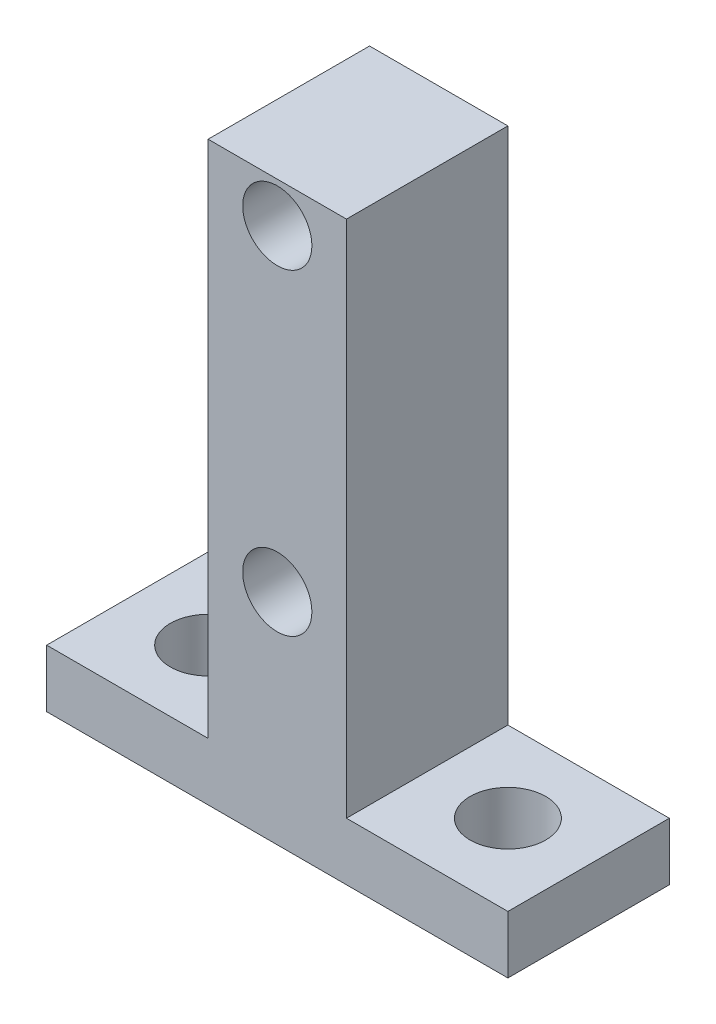
ISO-10303-21;
HEADER;
FILE_DESCRIPTION(('STEP AP214'),'2;1');
FILE_NAME('part.step','',(''),(''),'','','');
FILE_SCHEMA(('AUTOMOTIVE_DESIGN { 1 0 10303 214 1 1 1 1 }'));
ENDSEC;
DATA;
#1=APPLICATION_CONTEXT('core data for automotive mechanical design processes');
#2=APPLICATION_PROTOCOL_DEFINITION('international standard','automotive_design',2000,#1);
#3=PRODUCT_CONTEXT('',#1,'mechanical');
#4=PRODUCT('Part','Part','',(#3));
#5=PRODUCT_RELATED_PRODUCT_CATEGORY('part','',(#4));
#6=PRODUCT_DEFINITION_FORMATION('','',#4);
#7=PRODUCT_DEFINITION_CONTEXT('part definition',#1,'design');
#8=PRODUCT_DEFINITION('design','',#6,#7);
#9=PRODUCT_DEFINITION_SHAPE('','',#8);
#10=(LENGTH_UNIT() NAMED_UNIT(*) SI_UNIT(.MILLI.,.METRE.));
#11=(NAMED_UNIT(*) PLANE_ANGLE_UNIT() SI_UNIT($,.RADIAN.));
#12=(NAMED_UNIT(*) SI_UNIT($,.STERADIAN.) SOLID_ANGLE_UNIT());
#13=UNCERTAINTY_MEASURE_WITH_UNIT(LENGTH_MEASURE(1.E-05),#10,'distance_accuracy_value','');
#14=(GEOMETRIC_REPRESENTATION_CONTEXT(3) GLOBAL_UNCERTAINTY_ASSIGNED_CONTEXT((#13)) GLOBAL_UNIT_ASSIGNED_CONTEXT((#10,
#11,#12)) REPRESENTATION_CONTEXT('',''));
#15=CARTESIAN_POINT('',(0.,0.,0.));
#16=DIRECTION('',(0.,0.,1.));
#17=DIRECTION('',(1.,0.,0.));
#18=AXIS2_PLACEMENT_3D('',#15,#16,#17);
#19=CARTESIAN_POINT('',(0.,-6.35,0.));
#20=DIRECTION('',(0.,-1.,0.));
#21=DIRECTION('',(0.,0.,-1.));
#22=AXIS2_PLACEMENT_3D('',#19,#20,#21);
#23=PLANE('',#22);
#24=CARTESIAN_POINT('',(9.28687500000001,-6.35,20.32));
#25=DIRECTION('',(0.,-1.,0.));
#26=DIRECTION('',(0.,0.,-1.));
#27=AXIS2_PLACEMENT_3D('',#24,#25,#26);
#28=CIRCLE('',#27,2.0828);
#29=CARTESIAN_POINT('',(9.28687500000001,-6.35,18.2372));
#30=VERTEX_POINT('',#29);
#31=EDGE_CURVE('E157',#30,#30,#28,.T.);
#32=ORIENTED_EDGE('',*,*,#31,.F.);
#33=EDGE_LOOP('',(#32));
#34=FACE_BOUND('',#33,.T.);
#35=CARTESIAN_POINT('',(25.796875,-6.35,20.32));
#36=DIRECTION('',(0.,-1.,0.));
#37=DIRECTION('',(0.,0.,-1.));
#38=AXIS2_PLACEMENT_3D('',#35,#36,#37);
#39=CIRCLE('',#38,2.0828);
#40=CARTESIAN_POINT('',(25.796875,-6.35,18.2372));
#41=VERTEX_POINT('',#40);
#42=EDGE_CURVE('E217',#41,#41,#39,.T.);
#43=ORIENTED_EDGE('',*,*,#42,.F.);
#44=EDGE_LOOP('',(#43));
#45=FACE_BOUND('',#44,.T.);
#46=DIRECTION('',(1.,0.,0.));
#47=VECTOR('',#46,1.);
#48=CARTESIAN_POINT('',(21.351875,-6.35,24.765));
#49=LINE('',#48,#47);
#50=CARTESIAN_POINT('',(4.841875,-6.35,24.765));
#51=VERTEX_POINT('',#50);
#52=CARTESIAN_POINT('',(30.241875,-6.35,24.765));
#53=VERTEX_POINT('',#52);
#54=EDGE_CURVE('E199',#51,#53,#49,.T.);
#55=ORIENTED_EDGE('',*,*,#54,.F.);
#56=DIRECTION('',(0.,0.,-1.));
#57=VECTOR('',#56,1.);
#58=CARTESIAN_POINT('',(4.841875,-6.35,0.));
#59=LINE('',#58,#57);
#60=CARTESIAN_POINT('',(4.841875,-6.35,15.875));
#61=VERTEX_POINT('',#60);
#62=EDGE_CURVE('E168',#51,#61,#59,.T.);
#63=ORIENTED_EDGE('',*,*,#62,.T.);
#64=DIRECTION('',(-1.,0.,0.));
#65=VECTOR('',#64,1.);
#66=CARTESIAN_POINT('',(21.351875,-6.35,15.875));
#67=LINE('',#66,#65);
#68=CARTESIAN_POINT('',(30.241875,-6.35,15.875));
#69=VERTEX_POINT('',#68);
#70=EDGE_CURVE('E202',#69,#61,#67,.T.);
#71=ORIENTED_EDGE('',*,*,#70,.F.);
#72=DIRECTION('',(0.,0.,-1.));
#73=VECTOR('',#72,1.);
#74=CARTESIAN_POINT('',(30.241875,-6.35,0.));
#75=LINE('',#74,#73);
#76=EDGE_CURVE('E152',#53,#69,#75,.T.);
#77=ORIENTED_EDGE('',*,*,#76,.F.);
#78=EDGE_LOOP('',(#55,#63,#71,#77));
#79=FACE_BOUND('',#78,.T.);
#80=ADVANCED_FACE('F38',(#34,#45,#79),#23,.T.);
#81=CARTESIAN_POINT('',(21.351875,-6.35,24.765));
#82=DIRECTION('',(0.,0.,1.));
#83=DIRECTION('',(1.,0.,0.));
#84=AXIS2_PLACEMENT_3D('',#81,#82,#83);
#85=PLANE('',#84);
#86=DIRECTION('',(1.,0.,0.));
#87=VECTOR('',#86,1.);
#88=CARTESIAN_POINT('',(21.351875,-3.175,24.765));
#89=LINE('',#88,#87);
#90=CARTESIAN_POINT('',(21.351875,-3.175,24.765));
#91=VERTEX_POINT('',#90);
#92=CARTESIAN_POINT('',(30.241875,-3.175,24.765));
#93=VERTEX_POINT('',#92);
#94=EDGE_CURVE('E132',#91,#93,#89,.T.);
#95=ORIENTED_EDGE('',*,*,#94,.F.);
#96=DIRECTION('',(0.,1.,0.));
#97=VECTOR('',#96,1.);
#98=CARTESIAN_POINT('',(21.351875,-6.35,24.765));
#99=LINE('',#98,#97);
#100=CARTESIAN_POINT('',(21.351875,25.4,24.765));
#101=VERTEX_POINT('',#100);
#102=EDGE_CURVE('E119',#91,#101,#99,.T.);
#103=ORIENTED_EDGE('',*,*,#102,.T.);
#104=DIRECTION('',(1.,0.,0.));
#105=VECTOR('',#104,1.);
#106=CARTESIAN_POINT('',(21.351875,25.4,24.765));
#107=LINE('',#106,#105);
#108=CARTESIAN_POINT('',(13.731875,25.4,24.765));
#109=VERTEX_POINT('',#108);
#110=EDGE_CURVE('E187',#109,#101,#107,.T.);
#111=ORIENTED_EDGE('',*,*,#110,.F.);
#112=DIRECTION('',(0.,1.,0.));
#113=VECTOR('',#112,1.);
#114=CARTESIAN_POINT('',(13.731875,-6.35,24.765));
#115=LINE('',#114,#113);
#116=CARTESIAN_POINT('',(13.731875,-3.17500000000001,24.765));
#117=VERTEX_POINT('',#116);
#118=EDGE_CURVE('E48',#117,#109,#115,.T.);
#119=ORIENTED_EDGE('',*,*,#118,.F.);
#120=DIRECTION('',(1.,0.,0.));
#121=VECTOR('',#120,1.);
#122=CARTESIAN_POINT('',(4.841875,-3.175,24.765));
#123=LINE('',#122,#121);
#124=CARTESIAN_POINT('',(4.841875,-3.175,24.765));
#125=VERTEX_POINT('',#124);
#126=EDGE_CURVE('E140',#125,#117,#123,.T.);
#127=ORIENTED_EDGE('',*,*,#126,.F.);
#128=DIRECTION('',(0.,1.,0.));
#129=VECTOR('',#128,1.);
#130=CARTESIAN_POINT('',(4.841875,-18.9223585694968,24.765));
#131=LINE('',#130,#129);
#132=EDGE_CURVE('E150',#51,#125,#131,.T.);
#133=ORIENTED_EDGE('',*,*,#132,.F.);
#134=ORIENTED_EDGE('',*,*,#54,.T.);
#135=DIRECTION('',(0.,1.,0.));
#136=VECTOR('',#135,1.);
#137=CARTESIAN_POINT('',(30.241875,-18.9223585694968,24.765));
#138=LINE('',#137,#136);
#139=EDGE_CURVE('E151',#53,#93,#138,.T.);
#140=ORIENTED_EDGE('',*,*,#139,.T.);
#141=EDGE_LOOP('',(#95,#103,#111,#119,#127,#133,#134,#140));
#142=FACE_BOUND('',#141,.T.);
#143=CARTESIAN_POINT('',(17.541875,5.715,24.765));
#144=DIRECTION('',(0.,0.,1.));
#145=DIRECTION('',(1.,0.,0.));
#146=AXIS2_PLACEMENT_3D('',#143,#144,#145);
#147=CIRCLE('',#146,1.905);
#148=CARTESIAN_POINT('',(19.446875,5.715,24.765));
#149=VERTEX_POINT('',#148);
#150=EDGE_CURVE('E183',#149,#149,#147,.T.);
#151=ORIENTED_EDGE('',*,*,#150,.F.);
#152=EDGE_LOOP('',(#151));
#153=FACE_BOUND('',#152,.T.);
#154=CARTESIAN_POINT('',(17.541875,23.1775,24.765));
#155=DIRECTION('',(0.,0.,1.));
#156=DIRECTION('',(1.,0.,0.));
#157=AXIS2_PLACEMENT_3D('',#154,#155,#156);
#158=CIRCLE('',#157,1.905);
#159=CARTESIAN_POINT('',(19.446875,23.1775,24.765));
#160=VERTEX_POINT('',#159);
#161=EDGE_CURVE('E178',#160,#160,#158,.T.);
#162=ORIENTED_EDGE('',*,*,#161,.F.);
#163=EDGE_LOOP('',(#162));
#164=FACE_BOUND('',#163,.T.);
#165=ADVANCED_FACE('F40',(#142,#153,#164),#85,.T.);
#166=CARTESIAN_POINT('',(21.351875,-6.35,15.875));
#167=DIRECTION('',(0.,0.,-1.));
#168=DIRECTION('',(-1.,0.,0.));
#169=AXIS2_PLACEMENT_3D('',#166,#167,#168);
#170=PLANE('',#169);
#171=CARTESIAN_POINT('',(17.541875,5.715,15.875));
#172=DIRECTION('',(0.,0.,-1.));
#173=DIRECTION('',(-1.,0.,0.));
#174=AXIS2_PLACEMENT_3D('',#171,#172,#173);
#175=CIRCLE('',#174,1.905);
#176=CARTESIAN_POINT('',(19.446875,5.715,15.875));
#177=VERTEX_POINT('',#176);
#178=EDGE_CURVE('E182',#177,#177,#175,.T.);
#179=ORIENTED_EDGE('',*,*,#178,.F.);
#180=EDGE_LOOP('',(#179));
#181=FACE_BOUND('',#180,.T.);
#182=CARTESIAN_POINT('',(17.541875,23.1775,15.875));
#183=DIRECTION('',(0.,0.,-1.));
#184=DIRECTION('',(-1.,0.,0.));
#185=AXIS2_PLACEMENT_3D('',#182,#183,#184);
#186=CIRCLE('',#185,1.905);
#187=CARTESIAN_POINT('',(19.446875,23.1775,15.875));
#188=VERTEX_POINT('',#187);
#189=EDGE_CURVE('E172',#188,#188,#186,.T.);
#190=ORIENTED_EDGE('',*,*,#189,.F.);
#191=EDGE_LOOP('',(#190));
#192=FACE_BOUND('',#191,.T.);
#193=DIRECTION('',(0.,1.,0.));
#194=VECTOR('',#193,1.);
#195=CARTESIAN_POINT('',(21.351875,-6.35,15.875));
#196=LINE('',#195,#194);
#197=CARTESIAN_POINT('',(21.351875,-3.175,15.875));
#198=VERTEX_POINT('',#197);
#199=CARTESIAN_POINT('',(21.351875,25.4,15.875));
#200=VERTEX_POINT('',#199);
#201=EDGE_CURVE('E107',#198,#200,#196,.T.);
#202=ORIENTED_EDGE('',*,*,#201,.F.);
#203=DIRECTION('',(-1.,0.,0.));
#204=VECTOR('',#203,1.);
#205=CARTESIAN_POINT('',(-27.543125,-3.175,15.875));
#206=LINE('',#205,#204);
#207=CARTESIAN_POINT('',(30.241875,-3.175,15.875));
#208=VERTEX_POINT('',#207);
#209=EDGE_CURVE('E11',#208,#198,#206,.T.);
#210=ORIENTED_EDGE('',*,*,#209,.F.);
#211=DIRECTION('',(0.,1.,0.));
#212=VECTOR('',#211,1.);
#213=CARTESIAN_POINT('',(30.241875,-18.9223585694968,15.875));
#214=LINE('',#213,#212);
#215=EDGE_CURVE('E156',#69,#208,#214,.T.);
#216=ORIENTED_EDGE('',*,*,#215,.F.);
#217=ORIENTED_EDGE('',*,*,#70,.T.);
#218=DIRECTION('',(0.,1.,0.));
#219=VECTOR('',#218,1.);
#220=CARTESIAN_POINT('',(4.841875,-18.9223585694968,15.875));
#221=LINE('',#220,#219);
#222=CARTESIAN_POINT('',(4.84187500000001,-3.175,15.875));
#223=VERTEX_POINT('',#222);
#224=EDGE_CURVE('E167',#61,#223,#221,.T.);
#225=ORIENTED_EDGE('',*,*,#224,.T.);
#226=DIRECTION('',(-1.,0.,0.));
#227=VECTOR('',#226,1.);
#228=CARTESIAN_POINT('',(21.351875,-3.17500000000001,15.875));
#229=LINE('',#228,#227);
#230=CARTESIAN_POINT('',(13.731875,-3.175,15.875));
#231=VERTEX_POINT('',#230);
#232=EDGE_CURVE('E56',#231,#223,#229,.T.);
#233=ORIENTED_EDGE('',*,*,#232,.F.);
#234=DIRECTION('',(0.,1.,0.));
#235=VECTOR('',#234,1.);
#236=CARTESIAN_POINT('',(13.731875,-6.35,15.875));
#237=LINE('',#236,#235);
#238=CARTESIAN_POINT('',(13.731875,25.4,15.875));
#239=VERTEX_POINT('',#238);
#240=EDGE_CURVE('E118',#231,#239,#237,.T.);
#241=ORIENTED_EDGE('',*,*,#240,.T.);
#242=DIRECTION('',(-1.,0.,0.));
#243=VECTOR('',#242,1.);
#244=CARTESIAN_POINT('',(21.351875,25.4,15.875));
#245=LINE('',#244,#243);
#246=EDGE_CURVE('E112',#200,#239,#245,.T.);
#247=ORIENTED_EDGE('',*,*,#246,.F.);
#248=EDGE_LOOP('',(#202,#210,#216,#217,#225,#233,#241,#247));
#249=FACE_BOUND('',#248,.T.);
#250=ADVANCED_FACE('F108',(#181,#192,#249),#170,.T.);
#251=CARTESIAN_POINT('',(13.731875,-6.35,24.765));
#252=DIRECTION('',(-1.,0.,0.));
#253=DIRECTION('',(0.,0.,1.));
#254=AXIS2_PLACEMENT_3D('',#251,#252,#253);
#255=PLANE('',#254);
#256=ORIENTED_EDGE('',*,*,#240,.F.);
#257=DIRECTION('',(0.,0.,1.));
#258=VECTOR('',#257,1.);
#259=CARTESIAN_POINT('',(13.731875,-3.17500000000001,0.));
#260=LINE('',#259,#258);
#261=EDGE_CURVE('E137',#231,#117,#260,.T.);
#262=ORIENTED_EDGE('',*,*,#261,.T.);
#263=ORIENTED_EDGE('',*,*,#118,.T.);
#264=DIRECTION('',(0.,0.,1.));
#265=VECTOR('',#264,1.);
#266=CARTESIAN_POINT('',(13.731875,25.4,24.765));
#267=LINE('',#266,#265);
#268=EDGE_CURVE('E196',#239,#109,#267,.T.);
#269=ORIENTED_EDGE('',*,*,#268,.F.);
#270=EDGE_LOOP('',(#256,#262,#263,#269));
#271=FACE_BOUND('',#270,.T.);
#272=ADVANCED_FACE('F249',(#271),#255,.T.);
#273=CARTESIAN_POINT('',(21.351875,-6.35,24.765));
#274=DIRECTION('',(1.,0.,0.));
#275=DIRECTION('',(0.,0.,-1.));
#276=AXIS2_PLACEMENT_3D('',#273,#274,#275);
#277=PLANE('',#276);
#278=DIRECTION('',(0.,0.,1.));
#279=VECTOR('',#278,1.);
#280=CARTESIAN_POINT('',(21.351875,-3.175,0.));
#281=LINE('',#280,#279);
#282=EDGE_CURVE('E125',#198,#91,#281,.T.);
#283=ORIENTED_EDGE('',*,*,#282,.F.);
#284=ORIENTED_EDGE('',*,*,#201,.T.);
#285=DIRECTION('',(0.,0.,-1.));
#286=VECTOR('',#285,1.);
#287=CARTESIAN_POINT('',(21.351875,25.4,24.765));
#288=LINE('',#287,#286);
#289=EDGE_CURVE('E191',#101,#200,#288,.T.);
#290=ORIENTED_EDGE('',*,*,#289,.F.);
#291=ORIENTED_EDGE('',*,*,#102,.F.);
#292=EDGE_LOOP('',(#283,#284,#290,#291));
#293=FACE_BOUND('',#292,.T.);
#294=ADVANCED_FACE('F129',(#293),#277,.T.);
#295=CARTESIAN_POINT('',(0.,25.4,0.));
#296=DIRECTION('',(0.,-1.,0.));
#297=DIRECTION('',(0.,0.,-1.));
#298=AXIS2_PLACEMENT_3D('',#295,#296,#297);
#299=PLANE('',#298);
#300=ORIENTED_EDGE('',*,*,#110,.T.);
#301=ORIENTED_EDGE('',*,*,#289,.T.);
#302=ORIENTED_EDGE('',*,*,#246,.T.);
#303=ORIENTED_EDGE('',*,*,#268,.T.);
#304=EDGE_LOOP('',(#300,#301,#302,#303));
#305=FACE_BOUND('',#304,.T.);
#306=ADVANCED_FACE('F248',(#305),#299,.F.);
#307=CARTESIAN_POINT('',(17.541875,23.1775,0.));
#308=DIRECTION('',(0.,0.,1.));
#309=DIRECTION('',(1.,0.,0.));
#310=AXIS2_PLACEMENT_3D('',#307,#308,#309);
#311=CYLINDRICAL_SURFACE('',#310,1.905);
#312=CARTESIAN_POINT('',(19.446875,23.1775,24.765));
#313=CARTESIAN_POINT('',(19.446875,23.1775,24.6723958333333));
#314=CARTESIAN_POINT('',(19.446875,23.1775,24.5797916666667));
#315=CARTESIAN_POINT('',(19.446875,23.1775,24.3945833333333));
#316=CARTESIAN_POINT('',(19.446875,23.1775,24.3019791666667));
#317=CARTESIAN_POINT('',(19.446875,23.1775,24.1167708333333));
#318=CARTESIAN_POINT('',(19.446875,23.1775,24.0241666666667));
#319=CARTESIAN_POINT('',(19.446875,23.1775,23.8389583333333));
#320=CARTESIAN_POINT('',(19.446875,23.1775,23.7463541666667));
#321=CARTESIAN_POINT('',(19.446875,23.1775,23.5611458333333));
#322=CARTESIAN_POINT('',(19.446875,23.1775,23.4685416666667));
#323=CARTESIAN_POINT('',(19.446875,23.1775,23.2833333333333));
#324=CARTESIAN_POINT('',(19.446875,23.1775,23.1907291666667));
#325=CARTESIAN_POINT('',(19.446875,23.1775,23.0055208333333));
#326=CARTESIAN_POINT('',(19.446875,23.1775,22.9129166666667));
#327=CARTESIAN_POINT('',(19.446875,23.1775,22.7277083333333));
#328=CARTESIAN_POINT('',(19.446875,23.1775,22.6351041666667));
#329=CARTESIAN_POINT('',(19.446875,23.1775,22.4498958333333));
#330=CARTESIAN_POINT('',(19.446875,23.1775,22.3572916666667));
#331=CARTESIAN_POINT('',(19.446875,23.1775,22.1720833333333));
#332=CARTESIAN_POINT('',(19.446875,23.1775,22.0794791666667));
#333=CARTESIAN_POINT('',(19.446875,23.1775,21.8942708333333));
#334=CARTESIAN_POINT('',(19.446875,23.1775,21.8016666666667));
#335=CARTESIAN_POINT('',(19.446875,23.1775,21.6164583333333));
#336=CARTESIAN_POINT('',(19.446875,23.1775,21.5238541666667));
#337=CARTESIAN_POINT('',(19.446875,23.1775,21.3386458333333));
#338=CARTESIAN_POINT('',(19.446875,23.1775,21.2460416666667));
#339=CARTESIAN_POINT('',(19.446875,23.1775,21.0608333333333));
#340=CARTESIAN_POINT('',(19.446875,23.1775,20.9682291666667));
#341=CARTESIAN_POINT('',(19.446875,23.1775,20.7830208333333));
#342=CARTESIAN_POINT('',(19.446875,23.1775,20.6904166666667));
#343=CARTESIAN_POINT('',(19.446875,23.1775,20.5052083333333));
#344=CARTESIAN_POINT('',(19.446875,23.1775,20.4126041666667));
#345=CARTESIAN_POINT('',(19.446875,23.1775,20.2273958333333));
#346=CARTESIAN_POINT('',(19.446875,23.1775,20.1347916666667));
#347=CARTESIAN_POINT('',(19.446875,23.1775,19.9495833333333));
#348=CARTESIAN_POINT('',(19.446875,23.1775,19.8569791666667));
#349=CARTESIAN_POINT('',(19.446875,23.1775,19.6717708333333));
#350=CARTESIAN_POINT('',(19.446875,23.1775,19.5791666666667));
#351=CARTESIAN_POINT('',(19.446875,23.1775,19.3939583333333));
#352=CARTESIAN_POINT('',(19.446875,23.1775,19.3013541666667));
#353=CARTESIAN_POINT('',(19.446875,23.1775,19.1161458333333));
#354=CARTESIAN_POINT('',(19.446875,23.1775,19.0235416666667));
#355=CARTESIAN_POINT('',(19.446875,23.1775,18.8383333333333));
#356=CARTESIAN_POINT('',(19.446875,23.1775,18.7457291666667));
#357=CARTESIAN_POINT('',(19.446875,23.1775,18.5605208333333));
#358=CARTESIAN_POINT('',(19.446875,23.1775,18.4679166666667));
#359=CARTESIAN_POINT('',(19.446875,23.1775,18.2827083333333));
#360=CARTESIAN_POINT('',(19.446875,23.1775,18.1901041666667));
#361=CARTESIAN_POINT('',(19.446875,23.1775,18.0048958333333));
#362=CARTESIAN_POINT('',(19.446875,23.1775,17.9122916666667));
#363=CARTESIAN_POINT('',(19.446875,23.1775,17.7270833333333));
#364=CARTESIAN_POINT('',(19.446875,23.1775,17.6344791666667));
#365=CARTESIAN_POINT('',(19.446875,23.1775,17.4492708333333));
#366=CARTESIAN_POINT('',(19.446875,23.1775,17.3566666666667));
#367=CARTESIAN_POINT('',(19.446875,23.1775,17.1714583333333));
#368=CARTESIAN_POINT('',(19.446875,23.1775,17.0788541666667));
#369=CARTESIAN_POINT('',(19.446875,23.1775,16.8936458333333));
#370=CARTESIAN_POINT('',(19.446875,23.1775,16.8010416666667));
#371=CARTESIAN_POINT('',(19.446875,23.1775,16.6158333333333));
#372=CARTESIAN_POINT('',(19.446875,23.1775,16.5232291666667));
#373=CARTESIAN_POINT('',(19.446875,23.1775,16.3380208333333));
#374=CARTESIAN_POINT('',(19.446875,23.1775,16.2454166666667));
#375=CARTESIAN_POINT('',(19.446875,23.1775,16.0602083333333));
#376=CARTESIAN_POINT('',(19.446875,23.1775,15.9676041666667));
#377=CARTESIAN_POINT('',(19.446875,23.1775,15.875));
#378=B_SPLINE_CURVE_WITH_KNOTS('',3,(#312,#313,#314,#315,#316,#317,#318,#319,#320,#321,#322,
#323,#324,#325,#326,#327,#328,#329,#330,#331,#332,#333,#334,#335,#336,#337,#338,#339,#340,#341,
#342,#343,#344,#345,#346,#347,#348,#349,#350,#351,#352,#353,#354,#355,#356,#357,#358,#359,#360,
#361,#362,#363,#364,#365,#366,#367,#368,#369,#370,#371,#372,#373,#374,#375,#376,#377),
.UNSPECIFIED.,.F.,.F.,(4,2,2,2,2,2,2,2,2,2,2,2,2,2,2,2,2,2,2,2,2,2,2,2,2,2,2,2,2,2,2,2,4),(0.,
0.277812499999999,0.555625000000001,0.833437499999999,1.11125,1.3890625,1.666875,1.9446875,
2.2225,2.5003125,2.778125,3.0559375,3.33375,3.6115625,3.889375,4.1671875,4.445,4.7228125,
5.000625,5.2784375,5.55625,5.8340625,6.111875,6.3896875,6.6675,6.9453125,7.223125,7.5009375,
7.77875,8.0565625,8.334375,8.6121875,8.89),.UNSPECIFIED.);
#379=EDGE_CURVE('BSEAM261',#160,#188,#378,.T.);
#380=ORIENTED_EDGE('',*,*,#161,.T.);
#381=ORIENTED_EDGE('',*,*,#189,.T.);
#382=ORIENTED_EDGE('',*,*,#379,.T.);
#383=ORIENTED_EDGE('',*,*,#379,.F.);
#384=EDGE_LOOP('',(#380,#382,#381,#383));
#385=FACE_BOUND('',#384,.T.);
#386=ADVANCED_FACE('F261',(#385),#311,.F.);
#387=CARTESIAN_POINT('',(17.541875,5.715,0.));
#388=DIRECTION('',(0.,0.,1.));
#389=DIRECTION('',(1.,0.,0.));
#390=AXIS2_PLACEMENT_3D('',#387,#388,#389);
#391=CYLINDRICAL_SURFACE('',#390,1.905);
#392=CARTESIAN_POINT('',(19.446875,5.715,24.765));
#393=CARTESIAN_POINT('',(19.446875,5.715,24.6723958333333));
#394=CARTESIAN_POINT('',(19.446875,5.715,24.5797916666667));
#395=CARTESIAN_POINT('',(19.446875,5.715,24.3945833333333));
#396=CARTESIAN_POINT('',(19.446875,5.715,24.3019791666667));
#397=CARTESIAN_POINT('',(19.446875,5.715,24.1167708333333));
#398=CARTESIAN_POINT('',(19.446875,5.715,24.0241666666667));
#399=CARTESIAN_POINT('',(19.446875,5.715,23.8389583333333));
#400=CARTESIAN_POINT('',(19.446875,5.715,23.7463541666667));
#401=CARTESIAN_POINT('',(19.446875,5.715,23.5611458333333));
#402=CARTESIAN_POINT('',(19.446875,5.715,23.4685416666667));
#403=CARTESIAN_POINT('',(19.446875,5.715,23.2833333333333));
#404=CARTESIAN_POINT('',(19.446875,5.715,23.1907291666667));
#405=CARTESIAN_POINT('',(19.446875,5.715,23.0055208333333));
#406=CARTESIAN_POINT('',(19.446875,5.715,22.9129166666667));
#407=CARTESIAN_POINT('',(19.446875,5.715,22.7277083333333));
#408=CARTESIAN_POINT('',(19.446875,5.715,22.6351041666667));
#409=CARTESIAN_POINT('',(19.446875,5.715,22.4498958333333));
#410=CARTESIAN_POINT('',(19.446875,5.715,22.3572916666667));
#411=CARTESIAN_POINT('',(19.446875,5.715,22.1720833333333));
#412=CARTESIAN_POINT('',(19.446875,5.715,22.0794791666667));
#413=CARTESIAN_POINT('',(19.446875,5.715,21.8942708333333));
#414=CARTESIAN_POINT('',(19.446875,5.715,21.8016666666667));
#415=CARTESIAN_POINT('',(19.446875,5.715,21.6164583333333));
#416=CARTESIAN_POINT('',(19.446875,5.715,21.5238541666667));
#417=CARTESIAN_POINT('',(19.446875,5.715,21.3386458333333));
#418=CARTESIAN_POINT('',(19.446875,5.715,21.2460416666667));
#419=CARTESIAN_POINT('',(19.446875,5.715,21.0608333333333));
#420=CARTESIAN_POINT('',(19.446875,5.715,20.9682291666667));
#421=CARTESIAN_POINT('',(19.446875,5.715,20.7830208333333));
#422=CARTESIAN_POINT('',(19.446875,5.715,20.6904166666667));
#423=CARTESIAN_POINT('',(19.446875,5.715,20.5052083333333));
#424=CARTESIAN_POINT('',(19.446875,5.715,20.4126041666667));
#425=CARTESIAN_POINT('',(19.446875,5.715,20.2273958333333));
#426=CARTESIAN_POINT('',(19.446875,5.715,20.1347916666667));
#427=CARTESIAN_POINT('',(19.446875,5.715,19.9495833333333));
#428=CARTESIAN_POINT('',(19.446875,5.715,19.8569791666667));
#429=CARTESIAN_POINT('',(19.446875,5.715,19.6717708333333));
#430=CARTESIAN_POINT('',(19.446875,5.715,19.5791666666667));
#431=CARTESIAN_POINT('',(19.446875,5.715,19.3939583333333));
#432=CARTESIAN_POINT('',(19.446875,5.715,19.3013541666667));
#433=CARTESIAN_POINT('',(19.446875,5.715,19.1161458333333));
#434=CARTESIAN_POINT('',(19.446875,5.715,19.0235416666667));
#435=CARTESIAN_POINT('',(19.446875,5.715,18.8383333333333));
#436=CARTESIAN_POINT('',(19.446875,5.715,18.7457291666667));
#437=CARTESIAN_POINT('',(19.446875,5.715,18.5605208333333));
#438=CARTESIAN_POINT('',(19.446875,5.715,18.4679166666667));
#439=CARTESIAN_POINT('',(19.446875,5.715,18.2827083333333));
#440=CARTESIAN_POINT('',(19.446875,5.715,18.1901041666667));
#441=CARTESIAN_POINT('',(19.446875,5.715,18.0048958333333));
#442=CARTESIAN_POINT('',(19.446875,5.715,17.9122916666667));
#443=CARTESIAN_POINT('',(19.446875,5.715,17.7270833333333));
#444=CARTESIAN_POINT('',(19.446875,5.715,17.6344791666667));
#445=CARTESIAN_POINT('',(19.446875,5.715,17.4492708333333));
#446=CARTESIAN_POINT('',(19.446875,5.715,17.3566666666667));
#447=CARTESIAN_POINT('',(19.446875,5.715,17.1714583333333));
#448=CARTESIAN_POINT('',(19.446875,5.715,17.0788541666667));
#449=CARTESIAN_POINT('',(19.446875,5.715,16.8936458333333));
#450=CARTESIAN_POINT('',(19.446875,5.715,16.8010416666667));
#451=CARTESIAN_POINT('',(19.446875,5.715,16.6158333333333));
#452=CARTESIAN_POINT('',(19.446875,5.715,16.5232291666667));
#453=CARTESIAN_POINT('',(19.446875,5.715,16.3380208333333));
#454=CARTESIAN_POINT('',(19.446875,5.715,16.2454166666667));
#455=CARTESIAN_POINT('',(19.446875,5.715,16.0602083333333));
#456=CARTESIAN_POINT('',(19.446875,5.715,15.9676041666667));
#457=CARTESIAN_POINT('',(19.446875,5.715,15.875));
#458=B_SPLINE_CURVE_WITH_KNOTS('',3,(#392,#393,#394,#395,#396,#397,#398,#399,#400,#401,#402,
#403,#404,#405,#406,#407,#408,#409,#410,#411,#412,#413,#414,#415,#416,#417,#418,#419,#420,#421,
#422,#423,#424,#425,#426,#427,#428,#429,#430,#431,#432,#433,#434,#435,#436,#437,#438,#439,#440,
#441,#442,#443,#444,#445,#446,#447,#448,#449,#450,#451,#452,#453,#454,#455,#456,#457),
.UNSPECIFIED.,.F.,.F.,(4,2,2,2,2,2,2,2,2,2,2,2,2,2,2,2,2,2,2,2,2,2,2,2,2,2,2,2,2,2,2,2,4),(0.,
0.277812499999999,0.555625000000001,0.833437499999999,1.11125,1.3890625,1.666875,1.9446875,
2.2225,2.5003125,2.778125,3.0559375,3.33375,3.6115625,3.889375,4.1671875,4.445,4.7228125,
5.000625,5.2784375,5.55625,5.8340625,6.111875,6.3896875,6.6675,6.9453125,7.223125,7.5009375,
7.77875,8.0565625,8.334375,8.6121875,8.89),.UNSPECIFIED.);
#459=EDGE_CURVE('BSEAM264',#149,#177,#458,.T.);
#460=ORIENTED_EDGE('',*,*,#150,.T.);
#461=ORIENTED_EDGE('',*,*,#178,.T.);
#462=ORIENTED_EDGE('',*,*,#459,.T.);
#463=ORIENTED_EDGE('',*,*,#459,.F.);
#464=EDGE_LOOP('',(#460,#462,#461,#463));
#465=FACE_BOUND('',#464,.T.);
#466=ADVANCED_FACE('F264',(#465),#391,.F.);
#467=CARTESIAN_POINT('',(4.841875,-18.9223585694968,0.));
#468=DIRECTION('',(1.,0.,0.));
#469=DIRECTION('',(0.,1.,0.));
#470=AXIS2_PLACEMENT_3D('',#467,#468,#469);
#471=PLANE('',#470);
#472=ORIENTED_EDGE('',*,*,#62,.F.);
#473=ORIENTED_EDGE('',*,*,#132,.T.);
#474=DIRECTION('',(0.,0.,-1.));
#475=VECTOR('',#474,1.);
#476=CARTESIAN_POINT('',(4.841875,-3.175,0.));
#477=LINE('',#476,#475);
#478=EDGE_CURVE('E163',#125,#223,#477,.T.);
#479=ORIENTED_EDGE('',*,*,#478,.T.);
#480=ORIENTED_EDGE('',*,*,#224,.F.);
#481=EDGE_LOOP('',(#472,#473,#479,#480));
#482=FACE_BOUND('',#481,.T.);
#483=ADVANCED_FACE('F239',(#482),#471,.F.);
#484=CARTESIAN_POINT('',(30.241875,-18.9223585694968,0.));
#485=DIRECTION('',(1.,0.,0.));
#486=DIRECTION('',(0.,1.,0.));
#487=AXIS2_PLACEMENT_3D('',#484,#485,#486);
#488=PLANE('',#487);
#489=ORIENTED_EDGE('',*,*,#139,.F.);
#490=ORIENTED_EDGE('',*,*,#76,.T.);
#491=ORIENTED_EDGE('',*,*,#215,.T.);
#492=DIRECTION('',(0.,0.,-1.));
#493=VECTOR('',#492,1.);
#494=CARTESIAN_POINT('',(30.241875,-3.175,0.));
#495=LINE('',#494,#493);
#496=EDGE_CURVE('E128',#93,#208,#495,.T.);
#497=ORIENTED_EDGE('',*,*,#496,.F.);
#498=EDGE_LOOP('',(#489,#490,#491,#497));
#499=FACE_BOUND('',#498,.T.);
#500=ADVANCED_FACE('F246',(#499),#488,.T.);
#501=CARTESIAN_POINT('',(25.796875,25.4,20.32));
#502=DIRECTION('',(0.,-1.,0.));
#503=DIRECTION('',(0.,0.,-1.));
#504=AXIS2_PLACEMENT_3D('',#501,#502,#503);
#505=CYLINDRICAL_SURFACE('',#504,2.0828);
#506=CARTESIAN_POINT('',(25.796875,-3.175,20.32));
#507=DIRECTION('',(0.,-1.,0.));
#508=DIRECTION('',(1.,0.,0.));
#509=AXIS2_PLACEMENT_3D('',#506,#507,#508);
#510=CIRCLE('',#509,2.0828);
#511=CARTESIAN_POINT('',(27.879675,-3.175,20.32));
#512=VERTEX_POINT('',#511);
#513=EDGE_CURVE('E42',#512,#512,#510,.F.);
#514=ORIENTED_EDGE('',*,*,#513,.T.);
#515=EDGE_LOOP('',(#514));
#516=FACE_BOUND('',#515,.T.);
#517=ORIENTED_EDGE('',*,*,#42,.T.);
#518=EDGE_LOOP('',(#517));
#519=FACE_BOUND('',#518,.T.);
#520=ADVANCED_FACE('F273',(#516,#519),#505,.F.);
#521=CARTESIAN_POINT('',(9.28687500000001,25.4,20.32));
#522=DIRECTION('',(0.,-1.,0.));
#523=DIRECTION('',(0.,0.,-1.));
#524=AXIS2_PLACEMENT_3D('',#521,#522,#523);
#525=CYLINDRICAL_SURFACE('',#524,2.0828);
#526=CARTESIAN_POINT('',(9.28687500000001,-3.175,20.32));
#527=DIRECTION('',(0.,-1.,0.));
#528=DIRECTION('',(1.,0.,0.));
#529=AXIS2_PLACEMENT_3D('',#526,#527,#528);
#530=CIRCLE('',#529,2.0828);
#531=CARTESIAN_POINT('',(11.369675,-3.17500000000001,20.32));
#532=VERTEX_POINT('',#531);
#533=EDGE_CURVE('E131',#532,#532,#530,.F.);
#534=ORIENTED_EDGE('',*,*,#533,.T.);
#535=EDGE_LOOP('',(#534));
#536=FACE_BOUND('',#535,.T.);
#537=ORIENTED_EDGE('',*,*,#31,.T.);
#538=EDGE_LOOP('',(#537));
#539=FACE_BOUND('',#538,.T.);
#540=ADVANCED_FACE('F225',(#536,#539),#525,.F.);
#541=CARTESIAN_POINT('',(4.841875,-3.175,0.));
#542=DIRECTION('',(0.,-1.,0.));
#543=DIRECTION('',(1.,0.,0.));
#544=AXIS2_PLACEMENT_3D('',#541,#542,#543);
#545=PLANE('',#544);
#546=ORIENTED_EDGE('',*,*,#232,.T.);
#547=ORIENTED_EDGE('',*,*,#478,.F.);
#548=ORIENTED_EDGE('',*,*,#126,.T.);
#549=ORIENTED_EDGE('',*,*,#261,.F.);
#550=EDGE_LOOP('',(#546,#547,#548,#549));
#551=FACE_BOUND('',#550,.T.);
#552=ORIENTED_EDGE('',*,*,#533,.F.);
#553=EDGE_LOOP('',(#552));
#554=FACE_BOUND('',#553,.T.);
#555=ADVANCED_FACE('F243',(#551,#554),#545,.F.);
#556=CARTESIAN_POINT('',(21.351875,-3.175,0.));
#557=DIRECTION('',(0.,-1.,0.));
#558=DIRECTION('',(1.,0.,0.));
#559=AXIS2_PLACEMENT_3D('',#556,#557,#558);
#560=PLANE('',#559);
#561=ORIENTED_EDGE('',*,*,#209,.T.);
#562=ORIENTED_EDGE('',*,*,#282,.T.);
#563=ORIENTED_EDGE('',*,*,#94,.T.);
#564=ORIENTED_EDGE('',*,*,#496,.T.);
#565=EDGE_LOOP('',(#561,#562,#563,#564));
#566=FACE_BOUND('',#565,.T.);
#567=ORIENTED_EDGE('',*,*,#513,.F.);
#568=EDGE_LOOP('',(#567));
#569=FACE_BOUND('',#568,.T.);
#570=ADVANCED_FACE('F123',(#566,#569),#560,.F.);
#571=CLOSED_SHELL('',(#80,#165,#250,#272,#294,#306,#386,#466,#483,#500,#520,#540,#555,#570));
#572=MANIFOLD_SOLID_BREP('B2',#571);
#573=ADVANCED_BREP_SHAPE_REPRESENTATION('',(#18,#572),#14);
#574=SHAPE_DEFINITION_REPRESENTATION(#9,#573);
ENDSEC;
END-ISO-10303-21;
